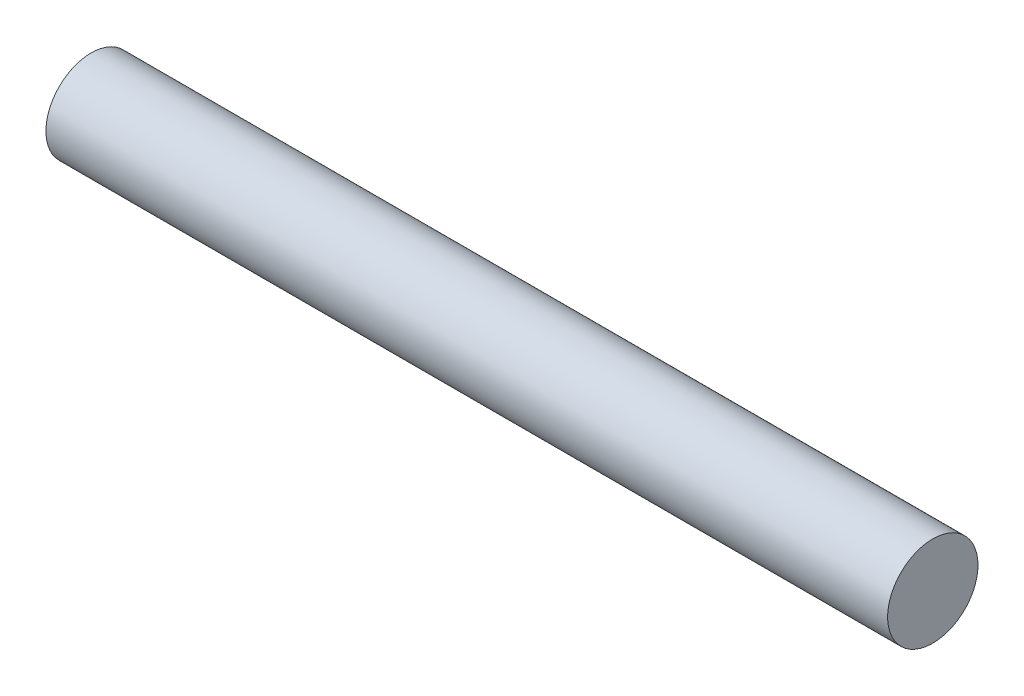
ISO-10303-21;
HEADER;
FILE_DESCRIPTION(('STEP AP214'),'2;1');
FILE_NAME('part.step','',(''),(''),'','','');
FILE_SCHEMA(('AUTOMOTIVE_DESIGN { 1 0 10303 214 1 1 1 1 }'));
ENDSEC;
DATA;
#1=APPLICATION_CONTEXT('core data for automotive mechanical design processes');
#2=APPLICATION_PROTOCOL_DEFINITION('international standard','automotive_design',2000,#1);
#3=PRODUCT_CONTEXT('',#1,'mechanical');
#4=PRODUCT('Part','Part','',(#3));
#5=PRODUCT_RELATED_PRODUCT_CATEGORY('part','',(#4));
#6=PRODUCT_DEFINITION_FORMATION('','',#4);
#7=PRODUCT_DEFINITION_CONTEXT('part definition',#1,'design');
#8=PRODUCT_DEFINITION('design','',#6,#7);
#9=PRODUCT_DEFINITION_SHAPE('','',#8);
#10=(LENGTH_UNIT() NAMED_UNIT(*) SI_UNIT(.MILLI.,.METRE.));
#11=(NAMED_UNIT(*) PLANE_ANGLE_UNIT() SI_UNIT($,.RADIAN.));
#12=(NAMED_UNIT(*) SI_UNIT($,.STERADIAN.) SOLID_ANGLE_UNIT());
#13=UNCERTAINTY_MEASURE_WITH_UNIT(LENGTH_MEASURE(1.E-05),#10,'distance_accuracy_value','');
#14=(GEOMETRIC_REPRESENTATION_CONTEXT(3) GLOBAL_UNCERTAINTY_ASSIGNED_CONTEXT((#13)) GLOBAL_UNIT_ASSIGNED_CONTEXT((#10,
#11,#12)) REPRESENTATION_CONTEXT('',''));
#15=CARTESIAN_POINT('',(0.,0.,0.));
#16=DIRECTION('',(0.,0.,1.));
#17=DIRECTION('',(1.,0.,0.));
#18=AXIS2_PLACEMENT_3D('',#15,#16,#17);
#19=CARTESIAN_POINT('',(745.,0.,0.));
#20=DIRECTION('',(-1.,0.,0.));
#21=DIRECTION('',(0.,0.,1.));
#22=AXIS2_PLACEMENT_3D('',#19,#20,#21);
#23=CYLINDRICAL_SURFACE('',#22,40.);
#24=CARTESIAN_POINT('',(745.,0.,0.));
#25=DIRECTION('',(1.,0.,0.));
#26=DIRECTION('',(0.,0.,-1.));
#27=AXIS2_PLACEMENT_3D('',#24,#25,#26);
#28=CIRCLE('',#27,40.);
#29=CARTESIAN_POINT('',(745.,0.,-40.));
#30=VERTEX_POINT('',#29);
#31=EDGE_CURVE('E10',#30,#30,#28,.T.);
#32=ORIENTED_EDGE('',*,*,#31,.F.);
#33=EDGE_LOOP('',(#32));
#34=FACE_BOUND('',#33,.T.);
#35=CARTESIAN_POINT('',(0.,0.,0.));
#36=DIRECTION('',(1.,0.,0.));
#37=DIRECTION('',(0.,0.,-1.));
#38=AXIS2_PLACEMENT_3D('',#35,#36,#37);
#39=CIRCLE('',#38,40.);
#40=CARTESIAN_POINT('',(0.,0.,-40.));
#41=VERTEX_POINT('',#40);
#42=EDGE_CURVE('E36',#41,#41,#39,.T.);
#43=ORIENTED_EDGE('',*,*,#42,.T.);
#44=EDGE_LOOP('',(#43));
#45=FACE_BOUND('',#44,.T.);
#46=ADVANCED_FACE('F33',(#34,#45),#23,.T.);
#47=CARTESIAN_POINT('',(745.,0.,0.));
#48=DIRECTION('',(1.,0.,0.));
#49=DIRECTION('',(0.,0.,-1.));
#50=AXIS2_PLACEMENT_3D('',#47,#48,#49);
#51=PLANE('',#50);
#52=ORIENTED_EDGE('',*,*,#31,.T.);
#53=EDGE_LOOP('',(#52));
#54=FACE_BOUND('',#53,.T.);
#55=ADVANCED_FACE('F48',(#54),#51,.T.);
#56=CARTESIAN_POINT('',(0.,0.,0.));
#57=DIRECTION('',(1.,0.,0.));
#58=DIRECTION('',(0.,0.,-1.));
#59=AXIS2_PLACEMENT_3D('',#56,#57,#58);
#60=PLANE('',#59);
#61=ORIENTED_EDGE('',*,*,#42,.F.);
#62=EDGE_LOOP('',(#61));
#63=FACE_BOUND('',#62,.T.);
#64=ADVANCED_FACE('F46',(#63),#60,.F.);
#65=CLOSED_SHELL('',(#46,#55,#64));
#66=MANIFOLD_SOLID_BREP('B2',#65);
#67=ADVANCED_BREP_SHAPE_REPRESENTATION('',(#18,#66),#14);
#68=SHAPE_DEFINITION_REPRESENTATION(#9,#67);
ENDSEC;
END-ISO-10303-21;
